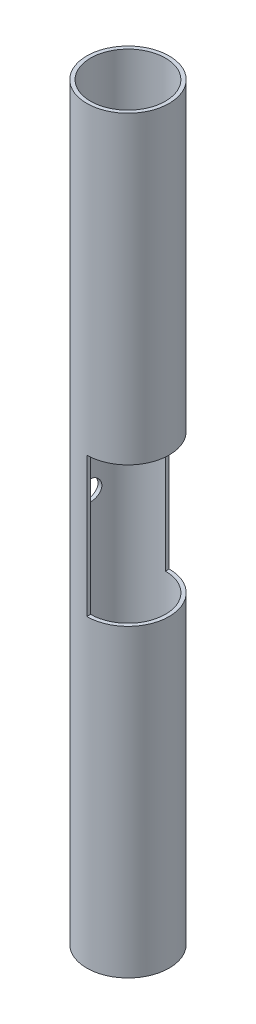
ISO-10303-21;
HEADER;
FILE_DESCRIPTION(('STEP AP214'),'2;1');
FILE_NAME('part.step','',(''),(''),'','','');
FILE_SCHEMA(('AUTOMOTIVE_DESIGN { 1 0 10303 214 1 1 1 1 }'));
ENDSEC;
DATA;
#1=APPLICATION_CONTEXT('core data for automotive mechanical design processes');
#2=APPLICATION_PROTOCOL_DEFINITION('international standard','automotive_design',2000,#1);
#3=PRODUCT_CONTEXT('',#1,'mechanical');
#4=PRODUCT('Part','Part','',(#3));
#5=PRODUCT_RELATED_PRODUCT_CATEGORY('part','',(#4));
#6=PRODUCT_DEFINITION_FORMATION('','',#4);
#7=PRODUCT_DEFINITION_CONTEXT('part definition',#1,'design');
#8=PRODUCT_DEFINITION('design','',#6,#7);
#9=PRODUCT_DEFINITION_SHAPE('','',#8);
#10=(LENGTH_UNIT() NAMED_UNIT(*) SI_UNIT(.MILLI.,.METRE.));
#11=(NAMED_UNIT(*) PLANE_ANGLE_UNIT() SI_UNIT($,.RADIAN.));
#12=(NAMED_UNIT(*) SI_UNIT($,.STERADIAN.) SOLID_ANGLE_UNIT());
#13=UNCERTAINTY_MEASURE_WITH_UNIT(LENGTH_MEASURE(1.E-05),#10,'distance_accuracy_value','');
#14=(GEOMETRIC_REPRESENTATION_CONTEXT(3) GLOBAL_UNCERTAINTY_ASSIGNED_CONTEXT((#13)) GLOBAL_UNIT_ASSIGNED_CONTEXT((#10,
#11,#12)) REPRESENTATION_CONTEXT('',''));
#15=CARTESIAN_POINT('',(0.,0.,0.));
#16=DIRECTION('',(0.,0.,1.));
#17=DIRECTION('',(1.,0.,0.));
#18=AXIS2_PLACEMENT_3D('',#15,#16,#17);
#19=CARTESIAN_POINT('',(0.,300.,0.));
#20=DIRECTION('',(0.,1.,0.));
#21=DIRECTION('',(0.,0.,1.));
#22=AXIS2_PLACEMENT_3D('',#19,#20,#21);
#23=PLANE('',#22);
#24=CARTESIAN_POINT('',(0.,300.,0.));
#25=DIRECTION('',(0.,1.,0.));
#26=DIRECTION('',(0.,0.,1.));
#27=AXIS2_PLACEMENT_3D('',#24,#25,#26);
#28=CIRCLE('',#27,16.5);
#29=CARTESIAN_POINT('',(0.,300.,16.5));
#30=VERTEX_POINT('',#29);
#31=EDGE_CURVE('E111',#30,#30,#28,.T.);
#32=ORIENTED_EDGE('',*,*,#31,.T.);
#33=EDGE_LOOP('',(#32));
#34=FACE_BOUND('',#33,.T.);
#35=CARTESIAN_POINT('',(0.,300.,0.));
#36=DIRECTION('',(0.,1.,0.));
#37=DIRECTION('',(0.,0.,1.));
#38=AXIS2_PLACEMENT_3D('',#35,#36,#37);
#39=CIRCLE('',#38,15.);
#40=CARTESIAN_POINT('',(0.,300.,15.));
#41=VERTEX_POINT('',#40);
#42=EDGE_CURVE('E103',#41,#41,#39,.T.);
#43=ORIENTED_EDGE('',*,*,#42,.F.);
#44=EDGE_LOOP('',(#43));
#45=FACE_BOUND('',#44,.T.);
#46=ADVANCED_FACE('F37',(#34,#45),#23,.T.);
#47=CARTESIAN_POINT('',(0.,0.,0.));
#48=DIRECTION('',(0.,1.,0.));
#49=DIRECTION('',(0.,0.,1.));
#50=AXIS2_PLACEMENT_3D('',#47,#48,#49);
#51=PLANE('',#50);
#52=CARTESIAN_POINT('',(0.,0.,0.));
#53=DIRECTION('',(0.,1.,0.));
#54=DIRECTION('',(0.,0.,1.));
#55=AXIS2_PLACEMENT_3D('',#52,#53,#54);
#56=CIRCLE('',#55,16.5);
#57=CARTESIAN_POINT('',(0.,0.,16.5));
#58=VERTEX_POINT('',#57);
#59=EDGE_CURVE('E109',#58,#58,#56,.T.);
#60=ORIENTED_EDGE('',*,*,#59,.F.);
#61=EDGE_LOOP('',(#60));
#62=FACE_BOUND('',#61,.T.);
#63=CARTESIAN_POINT('',(0.,0.,0.));
#64=DIRECTION('',(0.,1.,0.));
#65=DIRECTION('',(0.,0.,1.));
#66=AXIS2_PLACEMENT_3D('',#63,#64,#65);
#67=CIRCLE('',#66,15.);
#68=CARTESIAN_POINT('',(0.,0.,15.));
#69=VERTEX_POINT('',#68);
#70=EDGE_CURVE('E99',#69,#69,#67,.T.);
#71=ORIENTED_EDGE('',*,*,#70,.T.);
#72=EDGE_LOOP('',(#71));
#73=FACE_BOUND('',#72,.T.);
#74=ADVANCED_FACE('F152',(#62,#73),#51,.F.);
#75=CARTESIAN_POINT('',(0.,300.,0.));
#76=DIRECTION('',(0.,-1.,0.));
#77=DIRECTION('',(0.,0.,-1.));
#78=AXIS2_PLACEMENT_3D('',#75,#76,#77);
#79=CYLINDRICAL_SURFACE('',#78,16.5);
#80=CARTESIAN_POINT('',(-16.0078105935821,150.,-4.));
#81=CARTESIAN_POINT('',(-16.0078149259823,150.221110060156,-3.99999334869792));
#82=CARTESIAN_POINT('',(-16.0124417600335,150.442295240003,-3.98160394620758));
#83=CARTESIAN_POINT('',(-16.0304053313207,150.878329553851,-3.90864004358241));
#84=CARTESIAN_POINT('',(-16.043747446007,151.09317469036,-3.8540432026336));
#85=CARTESIAN_POINT('',(-16.0775437134049,151.510158887863,-3.71052250585112));
#86=CARTESIAN_POINT('',(-16.0979890342091,151.712313361207,-3.62164126312318));
#87=CARTESIAN_POINT('',(-16.1436771511436,152.098859477172,-3.41220274971822));
#88=CARTESIAN_POINT('',(-16.1689200756708,152.283250644199,-3.29164463124912));
#89=CARTESIAN_POINT('',(-16.2219439579509,152.632853990057,-3.0196097475034));
#90=CARTESIAN_POINT('',(-16.2497634720474,152.797644311395,-2.86759824784745));
#91=CARTESIAN_POINT('',(-16.3044707470342,153.099657239936,-2.53812412882763));
#92=CARTESIAN_POINT('',(-16.3313584245492,153.236877385563,-2.36065923930438));
#93=CARTESIAN_POINT('',(-16.3815974509393,153.481566309924,-1.98244132501651));
#94=CARTESIAN_POINT('',(-16.4048979926602,153.588622842865,-1.78141426502483));
#95=CARTESIAN_POINT('',(-16.4448986365963,153.767268575534,-1.36355973264542));
#96=CARTESIAN_POINT('',(-16.4615996528108,153.838862686969,-1.14673445315728));
#97=CARTESIAN_POINT('',(-16.4862469530262,153.943206208762,-0.707833592577179));
#98=CARTESIAN_POINT('',(-16.4943543588715,153.97667143091,-0.485937390870259));
#99=CARTESIAN_POINT('',(-16.5014616065046,154.006051864845,-0.0395421876310934));
#100=CARTESIAN_POINT('',(-16.5004627175599,154.001972309755,0.184956446808423));
#101=CARTESIAN_POINT('',(-16.4895906758375,153.956898471501,0.62522690805601));
#102=CARTESIAN_POINT('',(-16.4799032050204,153.916676546131,0.841083078444882));
#103=CARTESIAN_POINT('',(-16.4529574794825,153.801698467904,1.26288629957478));
#104=CARTESIAN_POINT('',(-16.43569883571,153.726940540372,1.46883284049667));
#105=CARTESIAN_POINT('',(-16.3952621866849,153.544373072738,1.86703316323855));
#106=CARTESIAN_POINT('',(-16.3720344360725,153.436284166436,2.05915360197755));
#107=CARTESIAN_POINT('',(-16.3221862672684,153.1903339287,2.42280273725807));
#108=CARTESIAN_POINT('',(-16.2955652909004,153.052467696381,2.59432803692088));
#109=CARTESIAN_POINT('',(-16.241038025827,152.746719074054,2.91652159318567));
#110=CARTESIAN_POINT('',(-16.2131162705109,152.578161379087,3.06654705262087));
#111=CARTESIAN_POINT('',(-16.1597588243213,152.217987272116,3.33633964914211));
#112=CARTESIAN_POINT('',(-16.1343232358973,152.026369910597,3.45610553961813));
#113=CARTESIAN_POINT('',(-16.0887659467506,151.624311756864,3.6623580728692));
#114=CARTESIAN_POINT('',(-16.0686677100752,151.413793119971,3.74869850729143));
#115=CARTESIAN_POINT('',(-16.0363668296641,150.980625980459,3.88456797440482));
#116=CARTESIAN_POINT('',(-16.0241626100172,150.757979908513,3.93410435471642));
#117=CARTESIAN_POINT('',(-16.0093600588041,150.312817073411,3.99391088236891));
#118=CARTESIAN_POINT('',(-16.0065301749452,150.090435050966,4.00512776947067));
#119=CARTESIAN_POINT('',(-16.0101678475989,149.646977310114,3.99056155248768));
#120=CARTESIAN_POINT('',(-16.0166346046767,149.425901481026,3.96478162982514));
#121=CARTESIAN_POINT('',(-16.0379158306782,148.994790850323,3.87778160584435));
#122=CARTESIAN_POINT('',(-16.0526021749343,148.784639431401,3.81710507191134));
#123=CARTESIAN_POINT('',(-16.0885476893024,148.37748908682,3.66263325613621));
#124=CARTESIAN_POINT('',(-16.1098076016516,148.180491649463,3.56883423418491));
#125=CARTESIAN_POINT('',(-16.1569976777946,147.801208118797,3.34877225903342));
#126=CARTESIAN_POINT('',(-16.1830072216668,147.619263062895,3.2219389096461));
#127=CARTESIAN_POINT('',(-16.2365675946941,147.278891067249,2.94013612434747));
#128=CARTESIAN_POINT('',(-16.2641186608951,147.120467758298,2.7851623528988));
#129=CARTESIAN_POINT('',(-16.318437104298,146.827842120402,2.44714810963203));
#130=CARTESIAN_POINT('',(-16.3451711192292,146.694292363619,2.26353635646872));
#131=CARTESIAN_POINT('',(-16.3941741985158,146.459925590613,1.87594044415805));
#132=CARTESIAN_POINT('',(-16.4164434914438,146.359106898551,1.67195732872908));
#133=CARTESIAN_POINT('',(-16.4538702312806,146.193912230584,1.25079457244716));
#134=CARTESIAN_POINT('',(-16.4690774752789,146.12928040103,1.03371991855496));
#135=CARTESIAN_POINT('',(-16.4908840580514,146.037516916671,0.591375692642481));
#136=CARTESIAN_POINT('',(-16.4974849526167,146.010378484037,0.366107609339109));
#137=CARTESIAN_POINT('',(-16.501275959251,145.994734254941,-0.0800827085718608));
#138=CARTESIAN_POINT('',(-16.4987013327013,146.005262702589,-0.300969612916896));
#139=CARTESIAN_POINT('',(-16.48494780391,146.062454500776,-0.73772650931836));
#140=CARTESIAN_POINT('',(-16.4737691301606,146.109116891728,-0.953596634445393));
#141=CARTESIAN_POINT('',(-16.4440952622027,146.236747197414,-1.37324767661593));
#142=CARTESIAN_POINT('',(-16.4256353316489,146.317549900461,-1.57708149541787));
#143=CARTESIAN_POINT('',(-16.3833493465182,146.511015403923,-1.9684120400639));
#144=CARTESIAN_POINT('',(-16.3595226520245,146.623682004103,-2.15590681398878));
#145=CARTESIAN_POINT('',(-16.3084032404054,146.880674195338,-2.51385079583647));
#146=CARTESIAN_POINT('',(-16.2810440409309,147.02566129471,-2.68381558331489));
#147=CARTESIAN_POINT('',(-16.2262562573709,147.341881634104,-2.99733107433365));
#148=CARTESIAN_POINT('',(-16.1988276576589,147.513121422017,-3.14087516836945));
#149=CARTESIAN_POINT('',(-16.1464703918619,147.880544461369,-3.39989701918469));
#150=CARTESIAN_POINT('',(-16.1215930514287,148.077107254327,-3.51484753436891));
#151=CARTESIAN_POINT('',(-16.0778328892237,148.487338768914,-3.7098994489932));
#152=CARTESIAN_POINT('',(-16.0589455236686,148.700994369729,-3.79002728086));
#153=CARTESIAN_POINT('',(-16.0323954278596,149.095364265118,-3.90061729232401));
#154=CARTESIAN_POINT('',(-16.0232433354466,149.274121602568,-3.93780715176516));
#155=CARTESIAN_POINT('',(-16.0109493555244,149.635235765172,-3.98750032804069));
#156=CARTESIAN_POINT('',(-16.0078070195111,149.817592320692,-4.00000548707995));
#157=CARTESIAN_POINT('',(-16.0078105935821,150.,-4.));
#158=B_SPLINE_CURVE_WITH_KNOTS('',3,(#80,#81,#82,#83,#84,#85,#86,#87,#88,#89,#90,#91,#92,#93,
#94,#95,#96,#97,#98,#99,#100,#101,#102,#103,#104,#105,#106,#107,#108,#109,#110,#111,#112,#113,
#114,#115,#116,#117,#118,#119,#120,#121,#122,#123,#124,#125,#126,#127,#128,#129,#130,#131,#132,
#133,#134,#135,#136,#137,#138,#139,#140,#141,#142,#143,#144,#145,#146,#147,#148,#149,#150,#151,
#152,#153,#154,#155,#156,#157),.UNSPECIFIED.,.T.,.F.,(4,2,2,2,2,2,2,2,2,2,2,2,2,2,2,2,2,2,2,2,2,
2,2,2,2,2,2,2,2,2,2,2,2,2,2,2,2,2,4),(0.,0.662660683146096,1.32573062391642,1.98797905717294,
2.65024521648899,3.32486350298729,3.99954199539427,4.68303762119854,5.36643855327388,
6.03678659853793,6.70704120974542,7.36330452495368,8.01960156681688,8.68155622272151,
9.34361990920109,10.0225529844666,10.7015140253259,11.3834122713416,12.0651743454895,
12.7299656644546,13.3946998202442,14.0493498273144,14.70407377949,15.3709534048022,
16.0379358622077,16.72050578139,17.4030407473059,18.0806869622387,18.7582106603878,
19.4184889627236,20.0787497310708,20.7358513157483,21.3930312927642,22.0651516695704,
22.7374399588017,23.4213330379484,24.104706092205,24.6514176217345,25.1980883489569),.UNSPECIFIED.);
#159=CARTESIAN_POINT('',(-16.0078105935821,150.,-4.));
#160=VERTEX_POINT('',#159);
#161=EDGE_CURVE('E86',#160,#160,#158,.T.);
#162=ORIENTED_EDGE('',*,*,#161,.T.);
#163=EDGE_LOOP('',(#162));
#164=FACE_BOUND('',#163,.T.);
#165=CARTESIAN_POINT('',(0.,178.,0.));
#166=DIRECTION('',(0.,-1.,0.));
#167=DIRECTION('',(0.,0.,-1.));
#168=AXIS2_PLACEMENT_3D('',#165,#166,#167);
#169=CIRCLE('',#168,16.5);
#170=CARTESIAN_POINT('',(0.,178.,-16.5));
#171=VERTEX_POINT('',#170);
#172=CARTESIAN_POINT('',(0.,178.,16.5));
#173=VERTEX_POINT('',#172);
#174=EDGE_CURVE('E100',#171,#173,#169,.T.);
#175=ORIENTED_EDGE('',*,*,#174,.F.);
#176=DIRECTION('',(0.,-1.,0.));
#177=VECTOR('',#176,1.);
#178=CARTESIAN_POINT('',(0.,300.,-16.5));
#179=LINE('',#178,#177);
#180=CARTESIAN_POINT('',(0.,122.,-16.5));
#181=VERTEX_POINT('',#180);
#182=EDGE_CURVE('E98',#171,#181,#179,.T.);
#183=ORIENTED_EDGE('',*,*,#182,.T.);
#184=CARTESIAN_POINT('',(0.,122.,0.));
#185=DIRECTION('',(0.,1.,0.));
#186=DIRECTION('',(0.,0.,1.));
#187=AXIS2_PLACEMENT_3D('',#184,#185,#186);
#188=CIRCLE('',#187,16.5);
#189=CARTESIAN_POINT('',(0.,122.,16.5));
#190=VERTEX_POINT('',#189);
#191=EDGE_CURVE('E91',#190,#181,#188,.T.);
#192=ORIENTED_EDGE('',*,*,#191,.F.);
#193=DIRECTION('',(0.,-1.,0.));
#194=VECTOR('',#193,1.);
#195=CARTESIAN_POINT('',(0.,122.,16.5));
#196=LINE('',#195,#194);
#197=EDGE_CURVE('E80',#173,#190,#196,.T.);
#198=ORIENTED_EDGE('',*,*,#197,.F.);
#199=EDGE_LOOP('',(#175,#183,#192,#198));
#200=FACE_BOUND('',#199,.T.);
#201=ORIENTED_EDGE('',*,*,#31,.F.);
#202=EDGE_LOOP('',(#201));
#203=FACE_BOUND('',#202,.T.);
#204=ORIENTED_EDGE('',*,*,#59,.T.);
#205=EDGE_LOOP('',(#204));
#206=FACE_BOUND('',#205,.T.);
#207=ADVANCED_FACE('F39',(#164,#200,#203,#206),#79,.T.);
#208=CARTESIAN_POINT('',(0.,300.,0.));
#209=DIRECTION('',(0.,-1.,0.));
#210=DIRECTION('',(0.,0.,-1.));
#211=AXIS2_PLACEMENT_3D('',#208,#209,#210);
#212=CYLINDRICAL_SURFACE('',#211,15.);
#213=CARTESIAN_POINT('',(-14.456832294801,150.,-4.));
#214=CARTESIAN_POINT('',(-14.456836113945,150.220351875481,-3.99999468631743));
#215=CARTESIAN_POINT('',(-14.4619252909935,150.440760000952,-3.98172986449486));
#216=CARTESIAN_POINT('',(-14.4816712231019,150.875210843113,-3.90929166520475));
#217=CARTESIAN_POINT('',(-14.4963327781587,151.089250309956,-3.85510027241906));
#218=CARTESIAN_POINT('',(-14.5334475035368,151.504616139894,-3.71271691120147));
#219=CARTESIAN_POINT('',(-14.5558897136841,151.705959917657,-3.62457275084354));
#220=CARTESIAN_POINT('',(-14.606023098408,152.09103348012,-3.41693569127406));
#221=CARTESIAN_POINT('',(-14.6337146806885,152.274761895014,-3.29744035682898));
#222=CARTESIAN_POINT('',(-14.6920027910693,152.623985093975,-3.02729695749119));
#223=CARTESIAN_POINT('',(-14.7226508223289,152.788974034929,-2.87600595008416));
#224=CARTESIAN_POINT('',(-14.7829540287301,153.091563153902,-2.54794854568042));
#225=CARTESIAN_POINT('',(-14.8126091006688,153.229160492284,-2.37117951069329));
#226=CARTESIAN_POINT('',(-14.8681597693684,153.475169876806,-1.99367634174654));
#227=CARTESIAN_POINT('',(-14.8939875252459,153.583079037266,-1.79260363975895));
#228=CARTESIAN_POINT('',(-14.9383825242367,153.763369270735,-1.37436608945817));
#229=CARTESIAN_POINT('',(-14.9569509915253,153.835756334563,-1.15720396175019));
#230=CARTESIAN_POINT('',(-14.9843710715292,153.941310440472,-0.718231923620168));
#231=CARTESIAN_POINT('',(-14.9934355350053,153.975337953252,-0.496642448401822));
#232=CARTESIAN_POINT('',(-15.001570492355,154.005914240214,-0.0507271070171399));
#233=CARTESIAN_POINT('',(-15.0006426589323,154.00246928726,0.173598294877073));
#234=CARTESIAN_POINT('',(-14.9890535171952,153.958804374921,0.612628474222694));
#235=CARTESIAN_POINT('',(-14.9786382805395,153.919514084727,0.827433201442207));
#236=CARTESIAN_POINT('',(-14.9495349718099,153.806775724436,1.24728263114213));
#237=CARTESIAN_POINT('',(-14.9308464280136,153.733325706628,1.45232677636124));
#238=CARTESIAN_POINT('',(-14.886931381996,153.553640304815,1.84920789029504));
#239=CARTESIAN_POINT('',(-14.8616417575466,153.447086385799,2.04089337265881));
#240=CARTESIAN_POINT('',(-14.8072493701969,153.204462360981,2.40397999752931));
#241=CARTESIAN_POINT('',(-14.7781458644853,153.068386501942,2.57537717617275));
#242=CARTESIAN_POINT('',(-14.7182254587482,152.765646284134,2.89857073893016));
#243=CARTESIAN_POINT('',(-14.6873833872759,152.598171109909,3.04960384035148));
#244=CARTESIAN_POINT('',(-14.6282681005693,152.239950647514,3.32162664209938));
#245=CARTESIAN_POINT('',(-14.5999950420307,152.049203941569,3.44261451061105));
#246=CARTESIAN_POINT('',(-14.549118045243,151.648199796381,3.651693583714));
#247=CARTESIAN_POINT('',(-14.5265501404503,151.437829298272,3.73957733196031));
#248=CARTESIAN_POINT('',(-14.4900865003605,151.004547001192,3.87848003366225));
#249=CARTESIAN_POINT('',(-14.4761886145698,150.781638327131,3.92950812921311));
#250=CARTESIAN_POINT('',(-14.459096712616,150.336745577922,3.99193514186922));
#251=CARTESIAN_POINT('',(-14.4555952643646,150.114932902752,4.00447265242678));
#252=CARTESIAN_POINT('',(-14.4588515677209,149.672380454389,3.99269962245616));
#253=CARTESIAN_POINT('',(-14.4656082275034,149.451640569522,3.96839300344559));
#254=CARTESIAN_POINT('',(-14.4883224864021,149.021886811815,3.88462543740026));
#255=CARTESIAN_POINT('',(-14.5041007939927,148.812729124125,3.82584895825866));
#256=CARTESIAN_POINT('',(-14.542905379049,148.407240737281,3.67557973450925));
#257=CARTESIAN_POINT('',(-14.5659326029695,148.210911717145,3.58408271753295));
#258=CARTESIAN_POINT('',(-14.6172714494615,147.831890085129,3.36865811017419));
#259=CARTESIAN_POINT('',(-14.6456880974578,147.649592048221,3.24406190475849));
#260=CARTESIAN_POINT('',(-14.7043568386728,147.308073396594,2.96680455975026));
#261=CARTESIAN_POINT('',(-14.7346092762046,147.148857130092,2.81413814445931));
#262=CARTESIAN_POINT('',(-14.7945992976893,146.8532950535,2.47980756500968));
#263=CARTESIAN_POINT('',(-14.824296730477,146.717743246043,2.2974328320177));
#264=CARTESIAN_POINT('',(-14.8789334003425,146.479178025179,1.9118568718815));
#265=CARTESIAN_POINT('',(-14.9038728906581,146.376162879842,1.70865675403778));
#266=CARTESIAN_POINT('',(-14.9460230179852,146.206540735277,1.28862826965176));
#267=CARTESIAN_POINT('',(-14.9632911696077,146.139661961113,1.07191570576469));
#268=CARTESIAN_POINT('',(-14.9884060757449,146.043422543871,0.629798769462647));
#269=CARTESIAN_POINT('',(-14.9962549180996,146.014053586451,0.404396334640491));
#270=CARTESIAN_POINT('',(-15.0015482687538,145.994188352517,-0.0412840026922998));
#271=CARTESIAN_POINT('',(-14.9993045257616,146.002527361738,-0.261507023055732));
#272=CARTESIAN_POINT('',(-14.9853698195772,146.05513698715,-0.697296609261442));
#273=CARTESIAN_POINT('',(-14.9736792110957,146.099406254234,-0.912863349625634));
#274=CARTESIAN_POINT('',(-14.9422262078185,146.221961209837,-1.33182024692843));
#275=CARTESIAN_POINT('',(-14.9225199437846,146.300010586945,-1.53528402370309));
#276=CARTESIAN_POINT('',(-14.8770963303299,146.487699203492,-1.92634419694272));
#277=CARTESIAN_POINT('',(-14.8513781379851,146.597342873226,-2.11393836332431));
#278=CARTESIAN_POINT('',(-14.7958266244824,146.848516544274,-2.47335653734735));
#279=CARTESIAN_POINT('',(-14.7659018674327,146.990818761397,-2.64462672346663));
#280=CARTESIAN_POINT('',(-14.7056800015451,147.30180549873,-2.96125074312266));
#281=CARTESIAN_POINT('',(-14.6753827967944,147.470496951639,-3.10659774486097));
#282=CARTESIAN_POINT('',(-14.6170791927771,147.833936791635,-3.37041400465124));
#283=CARTESIAN_POINT('',(-14.5891378244929,148.029176627314,-3.48822188522468));
#284=CARTESIAN_POINT('',(-14.5396278780694,148.437412621721,-3.68917378060109));
#285=CARTESIAN_POINT('',(-14.5180551344989,148.650397057079,-3.77234046734665));
#286=CARTESIAN_POINT('',(-14.4867200130775,149.052162672103,-3.89076248504963));
#287=CARTESIAN_POINT('',(-14.4756028054439,149.239202529113,-3.93163036798979));
#288=CARTESIAN_POINT('',(-14.4606577042314,149.617481115988,-3.9862498858776));
#289=CARTESIAN_POINT('',(-14.4568289795203,149.808719364578,-4.00000461264321));
#290=CARTESIAN_POINT('',(-14.456832294801,150.,-4.));
#291=B_SPLINE_CURVE_WITH_KNOTS('',3,(#213,#214,#215,#216,#217,#218,#219,#220,#221,#222,#223,
#224,#225,#226,#227,#228,#229,#230,#231,#232,#233,#234,#235,#236,#237,#238,#239,#240,#241,#242,
#243,#244,#245,#246,#247,#248,#249,#250,#251,#252,#253,#254,#255,#256,#257,#258,#259,#260,#261,
#262,#263,#264,#265,#266,#267,#268,#269,#270,#271,#272,#273,#274,#275,#276,#277,#278,#279,#280,
#281,#282,#283,#284,#285,#286,#287,#288,#289,#290),.UNSPECIFIED.,.T.,.F.,(4,2,2,2,2,2,2,2,2,2,2,
2,2,2,2,2,2,2,2,2,2,2,2,2,2,2,2,2,2,2,2,2,2,2,2,2,2,2,4),(0.,0.660352256232032,1.32103589570041,
1.98079262319237,2.64060061312211,3.31531832260422,3.99010594248923,4.67570414741607,
5.36118668608494,6.03096608632962,6.70063336771207,7.35341141601608,8.00622668881391,
8.66552897811141,9.32495986788983,10.0046352460066,10.6843520527916,11.3682603019536,
12.0519988484194,12.7153066848897,13.3785439269193,14.0290370087007,14.6796150573457,
15.3444926994047,16.0094954308787,16.6937181392418,17.3779044202112,18.0568707918772,
18.7356866392293,19.3936810983785,20.0516508523085,20.7050902974225,21.3586214153685,
22.0295770798807,22.7007093076701,23.3866007797608,24.0720426420754,24.6453393534799,
25.2185706858622),.UNSPECIFIED.);
#292=CARTESIAN_POINT('',(-14.456832294801,150.,-4.));
#293=VERTEX_POINT('',#292);
#294=EDGE_CURVE('E42',#293,#293,#291,.T.);
#295=ORIENTED_EDGE('',*,*,#294,.F.);
#296=EDGE_LOOP('',(#295));
#297=FACE_BOUND('',#296,.T.);
#298=DIRECTION('',(0.,-1.,0.));
#299=VECTOR('',#298,1.);
#300=CARTESIAN_POINT('',(0.,300.,-15.));
#301=LINE('',#300,#299);
#302=CARTESIAN_POINT('',(0.,178.,-15.));
#303=VERTEX_POINT('',#302);
#304=CARTESIAN_POINT('',(0.,122.,-15.));
#305=VERTEX_POINT('',#304);
#306=EDGE_CURVE('E11',#303,#305,#301,.T.);
#307=ORIENTED_EDGE('',*,*,#306,.F.);
#308=CARTESIAN_POINT('',(0.,178.,0.));
#309=DIRECTION('',(0.,-1.,0.));
#310=DIRECTION('',(0.,0.,-1.));
#311=AXIS2_PLACEMENT_3D('',#308,#309,#310);
#312=CIRCLE('',#311,15.);
#313=CARTESIAN_POINT('',(0.,178.,15.));
#314=VERTEX_POINT('',#313);
#315=EDGE_CURVE('E118',#303,#314,#312,.T.);
#316=ORIENTED_EDGE('',*,*,#315,.T.);
#317=DIRECTION('',(0.,-1.,0.));
#318=VECTOR('',#317,1.);
#319=CARTESIAN_POINT('',(0.,300.,15.));
#320=LINE('',#319,#318);
#321=CARTESIAN_POINT('',(0.,122.,15.));
#322=VERTEX_POINT('',#321);
#323=EDGE_CURVE('E114',#322,#314,#320,.F.);
#324=ORIENTED_EDGE('',*,*,#323,.F.);
#325=CARTESIAN_POINT('',(0.,122.,0.));
#326=DIRECTION('',(0.,1.,0.));
#327=DIRECTION('',(0.,0.,1.));
#328=AXIS2_PLACEMENT_3D('',#325,#326,#327);
#329=CIRCLE('',#328,15.);
#330=EDGE_CURVE('E51',#322,#305,#329,.T.);
#331=ORIENTED_EDGE('',*,*,#330,.T.);
#332=EDGE_LOOP('',(#307,#316,#324,#331));
#333=FACE_BOUND('',#332,.T.);
#334=ORIENTED_EDGE('',*,*,#42,.T.);
#335=EDGE_LOOP('',(#334));
#336=FACE_BOUND('',#335,.T.);
#337=ORIENTED_EDGE('',*,*,#70,.F.);
#338=EDGE_LOOP('',(#337));
#339=FACE_BOUND('',#338,.T.);
#340=ADVANCED_FACE('F123',(#297,#333,#336,#339),#212,.F.);
#341=CARTESIAN_POINT('',(28.,122.,16.5));
#342=DIRECTION('',(0.,1.,0.));
#343=DIRECTION('',(0.,0.,1.));
#344=AXIS2_PLACEMENT_3D('',#341,#342,#343);
#345=PLANE('',#344);
#346=ORIENTED_EDGE('',*,*,#191,.T.);
#347=DIRECTION('',(0.,0.,-1.));
#348=VECTOR('',#347,1.);
#349=CARTESIAN_POINT('',(0.,122.,16.5));
#350=LINE('',#349,#348);
#351=EDGE_CURVE('E85',#305,#181,#350,.T.);
#352=ORIENTED_EDGE('',*,*,#351,.F.);
#353=ORIENTED_EDGE('',*,*,#330,.F.);
#354=EDGE_CURVE('E63',#190,#322,#350,.T.);
#355=ORIENTED_EDGE('',*,*,#354,.F.);
#356=EDGE_LOOP('',(#346,#352,#353,#355));
#357=FACE_BOUND('',#356,.T.);
#358=ADVANCED_FACE('F89',(#357),#345,.T.);
#359=CARTESIAN_POINT('',(28.,178.,16.5));
#360=DIRECTION('',(0.,-1.,0.));
#361=DIRECTION('',(0.,0.,-1.));
#362=AXIS2_PLACEMENT_3D('',#359,#360,#361);
#363=PLANE('',#362);
#364=ORIENTED_EDGE('',*,*,#174,.T.);
#365=DIRECTION('',(0.,0.,1.));
#366=VECTOR('',#365,1.);
#367=CARTESIAN_POINT('',(0.,178.,16.5));
#368=LINE('',#367,#366);
#369=EDGE_CURVE('E58',#314,#173,#368,.T.);
#370=ORIENTED_EDGE('',*,*,#369,.F.);
#371=ORIENTED_EDGE('',*,*,#315,.F.);
#372=EDGE_CURVE('E129',#171,#303,#368,.T.);
#373=ORIENTED_EDGE('',*,*,#372,.F.);
#374=EDGE_LOOP('',(#364,#370,#371,#373));
#375=FACE_BOUND('',#374,.T.);
#376=ADVANCED_FACE('F126',(#375),#363,.T.);
#377=CARTESIAN_POINT('',(0.,0.,0.));
#378=DIRECTION('',(-1.,0.,0.));
#379=DIRECTION('',(0.,0.,1.));
#380=AXIS2_PLACEMENT_3D('',#377,#378,#379);
#381=PLANE('',#380);
#382=ORIENTED_EDGE('',*,*,#372,.T.);
#383=ORIENTED_EDGE('',*,*,#306,.T.);
#384=ORIENTED_EDGE('',*,*,#351,.T.);
#385=ORIENTED_EDGE('',*,*,#182,.F.);
#386=EDGE_LOOP('',(#382,#383,#384,#385));
#387=FACE_BOUND('',#386,.T.);
#388=ADVANCED_FACE('F143',(#387),#381,.F.);
#389=ORIENTED_EDGE('',*,*,#323,.T.);
#390=ORIENTED_EDGE('',*,*,#369,.T.);
#391=ORIENTED_EDGE('',*,*,#197,.T.);
#392=ORIENTED_EDGE('',*,*,#354,.T.);
#393=EDGE_LOOP('',(#389,#390,#391,#392));
#394=FACE_BOUND('',#393,.T.);
#395=ADVANCED_FACE('F81',(#394),#381,.F.);
#396=CARTESIAN_POINT('',(-30.,150.,0.));
#397=DIRECTION('',(1.,0.,0.));
#398=DIRECTION('',(0.,0.,-1.));
#399=AXIS2_PLACEMENT_3D('',#396,#397,#398);
#400=CYLINDRICAL_SURFACE('',#399,4.);
#401=ORIENTED_EDGE('',*,*,#294,.T.);
#402=EDGE_LOOP('',(#401));
#403=FACE_BOUND('',#402,.T.);
#404=ORIENTED_EDGE('',*,*,#161,.F.);
#405=EDGE_LOOP('',(#404));
#406=FACE_BOUND('',#405,.T.);
#407=ADVANCED_FACE('F135',(#403,#406),#400,.F.);
#408=CLOSED_SHELL('',(#46,#74,#207,#340,#358,#376,#388,#395,#407));
#409=MANIFOLD_SOLID_BREP('B2',#408);
#410=ADVANCED_BREP_SHAPE_REPRESENTATION('',(#18,#409),#14);
#411=SHAPE_DEFINITION_REPRESENTATION(#9,#410);
ENDSEC;
END-ISO-10303-21;
